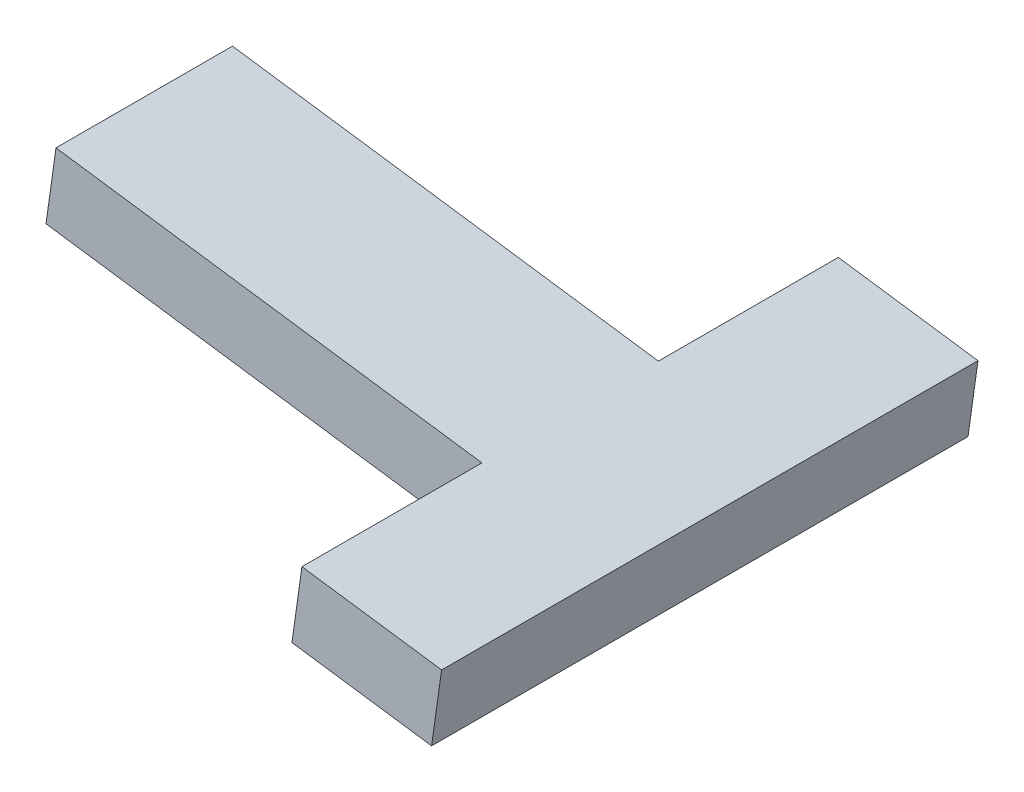
ISO-10303-21;
HEADER;
FILE_DESCRIPTION(('STEP AP214'),'2;1');
FILE_NAME('part.step','',(''),(''),'','','');
FILE_SCHEMA(('AUTOMOTIVE_DESIGN { 1 0 10303 214 1 1 1 1 }'));
ENDSEC;
DATA;
#1=APPLICATION_CONTEXT('core data for automotive mechanical design processes');
#2=APPLICATION_PROTOCOL_DEFINITION('international standard','automotive_design',2000,#1);
#3=PRODUCT_CONTEXT('',#1,'mechanical');
#4=PRODUCT('Part','Part','',(#3));
#5=PRODUCT_RELATED_PRODUCT_CATEGORY('part','',(#4));
#6=PRODUCT_DEFINITION_FORMATION('','',#4);
#7=PRODUCT_DEFINITION_CONTEXT('part definition',#1,'design');
#8=PRODUCT_DEFINITION('design','',#6,#7);
#9=PRODUCT_DEFINITION_SHAPE('','',#8);
#10=(LENGTH_UNIT() NAMED_UNIT(*) SI_UNIT(.MILLI.,.METRE.));
#11=(NAMED_UNIT(*) PLANE_ANGLE_UNIT() SI_UNIT($,.RADIAN.));
#12=(NAMED_UNIT(*) SI_UNIT($,.STERADIAN.) SOLID_ANGLE_UNIT());
#13=UNCERTAINTY_MEASURE_WITH_UNIT(LENGTH_MEASURE(1.E-05),#10,'distance_accuracy_value','');
#14=(GEOMETRIC_REPRESENTATION_CONTEXT(3) GLOBAL_UNCERTAINTY_ASSIGNED_CONTEXT((#13)) GLOBAL_UNIT_ASSIGNED_CONTEXT((#10,
#11,#12)) REPRESENTATION_CONTEXT('',''));
#15=CARTESIAN_POINT('',(0.,0.,0.));
#16=DIRECTION('',(0.,0.,1.));
#17=DIRECTION('',(1.,0.,0.));
#18=AXIS2_PLACEMENT_3D('',#15,#16,#17);
#19=CARTESIAN_POINT('',(883.811506568941,612.293995374237,2698.43487768757));
#20=DIRECTION('',(0.990268068741567,-0.139173100960088,0.));
#21=DIRECTION('',(-0.000106014336863081,-0.000754331202662863,-0.999999709872657));
#22=AXIS2_PLACEMENT_3D('',#19,#20,#21);
#23=PLANE('',#22);
#24=CARTESIAN_POINT('',(882.419775963119,602.39131755986,2698.44249513205));
#25=CARTESIAN_POINT('',(882.423759093866,602.419659007774,2736.0141076967));
#26=CARTESIAN_POINT('',(882.427742224612,602.448000455689,2773.58572026135));
#27=B_SPLINE_CURVE_WITH_KNOTS('',2,(#24,#25,#26),.UNSPECIFIED.,.F.,.F.,(3,3),(0.,1.),.UNSPECIFIED.);
#28=CARTESIAN_POINT('',(882.419775963119,602.39131755986,2698.44249513205));
#29=VERTEX_POINT('',#28);
#30=CARTESIAN_POINT('',(882.427742224612,602.448000455689,2773.58572026135));
#31=VERTEX_POINT('',#30);
#32=EDGE_CURVE('E122',#29,#31,#27,.T.);
#33=ORIENTED_EDGE('',*,*,#32,.F.);
#34=DIRECTION('',(-0.139173060582166,-0.990267781437723,0.000761744447259926));
#35=VECTOR('',#34,1.);
#36=CARTESIAN_POINT('',(883.811506568941,612.293995374237,2698.43487768757));
#37=LINE('',#36,#35);
#38=CARTESIAN_POINT('',(883.811506568941,612.293995374237,2698.43487768757));
#39=VERTEX_POINT('',#38);
#40=EDGE_CURVE('E33',#39,#29,#37,.T.);
#41=ORIENTED_EDGE('',*,*,#40,.F.);
#42=CARTESIAN_POINT('',(883.811506568941,612.293995374237,2698.43487768757));
#43=CARTESIAN_POINT('',(883.815489699688,612.322336822151,2736.00649025222));
#44=CARTESIAN_POINT('',(883.819472830434,612.350678270066,2773.57810281688));
#45=B_SPLINE_CURVE_WITH_KNOTS('',2,(#42,#43,#44),.UNSPECIFIED.,.F.,.F.,(3,3),(0.,1.),.UNSPECIFIED.);
#46=CARTESIAN_POINT('',(883.819472830434,612.350678270066,2773.57810281688));
#47=VERTEX_POINT('',#46);
#48=EDGE_CURVE('E182',#39,#47,#45,.T.);
#49=ORIENTED_EDGE('',*,*,#48,.T.);
#50=DIRECTION('',(-0.139173060582166,-0.990267781437723,0.000761744447259926));
#51=VECTOR('',#50,1.);
#52=CARTESIAN_POINT('',(883.819472830434,612.350678270066,2773.57810281688));
#53=LINE('',#52,#51);
#54=EDGE_CURVE('E11',#47,#31,#53,.T.);
#55=ORIENTED_EDGE('',*,*,#54,.T.);
#56=EDGE_LOOP('',(#33,#41,#49,#55));
#57=FACE_BOUND('',#56,.T.);
#58=ADVANCED_FACE('F17',(#57),#23,.T.);
#59=CARTESIAN_POINT('',(883.819472830434,612.350678270066,2773.57810281688));
#60=DIRECTION('',(0.000106014336862192,0.000754331202662988,0.999999709872657));
#61=DIRECTION('',(0.990268068741567,-0.139173100960088,0.));
#62=AXIS2_PLACEMENT_3D('',#59,#60,#61);
#63=PLANE('',#62);
#64=CARTESIAN_POINT('',(882.427742224612,602.448000455689,2773.58572026135));
#65=CARTESIAN_POINT('',(872.646649703891,603.822643362852,2773.58572026135));
#66=CARTESIAN_POINT('',(862.865557183169,605.197286270016,2773.58572026135));
#67=B_SPLINE_CURVE_WITH_KNOTS('',2,(#64,#65,#66),.UNSPECIFIED.,.F.,.F.,(3,3),(1.,2.),.UNSPECIFIED.);
#68=CARTESIAN_POINT('',(862.865557183169,605.197286270016,2773.58572026135));
#69=VERTEX_POINT('',#68);
#70=EDGE_CURVE('E130',#31,#69,#67,.T.);
#71=ORIENTED_EDGE('',*,*,#70,.F.);
#72=ORIENTED_EDGE('',*,*,#54,.F.);
#73=CARTESIAN_POINT('',(883.819472830434,612.350678270066,2773.57810281688));
#74=CARTESIAN_POINT('',(874.038380309712,613.72532117723,2773.57810281688));
#75=CARTESIAN_POINT('',(864.257287788991,615.099964084393,2773.57810281688));
#76=B_SPLINE_CURVE_WITH_KNOTS('',2,(#73,#74,#75),.UNSPECIFIED.,.F.,.F.,(3,3),(1.,2.),.UNSPECIFIED.);
#77=CARTESIAN_POINT('',(864.257287788991,615.099964084393,2773.57810281688));
#78=VERTEX_POINT('',#77);
#79=EDGE_CURVE('E194',#47,#78,#76,.T.);
#80=ORIENTED_EDGE('',*,*,#79,.T.);
#81=DIRECTION('',(-0.139173060582166,-0.990267781437723,0.000761744447259926));
#82=VECTOR('',#81,1.);
#83=CARTESIAN_POINT('',(864.257287788991,615.099964084393,2773.57810281688));
#84=LINE('',#83,#82);
#85=EDGE_CURVE('E25',#78,#69,#84,.T.);
#86=ORIENTED_EDGE('',*,*,#85,.T.);
#87=EDGE_LOOP('',(#71,#72,#80,#86));
#88=FACE_BOUND('',#87,.T.);
#89=ADVANCED_FACE('F193',(#88),#63,.T.);
#90=CARTESIAN_POINT('',(864.257287788991,615.099964084393,2773.57810281688));
#91=DIRECTION('',(-0.990268068741567,0.139173100960088,0.));
#92=DIRECTION('',(0.000106014336857196,0.000754331202663702,0.999999709872657));
#93=AXIS2_PLACEMENT_3D('',#90,#91,#92);
#94=PLANE('',#93);
#95=CARTESIAN_POINT('',(862.865557183169,605.197286270016,2773.58572026135));
#96=CARTESIAN_POINT('',(862.864220795076,605.187777374637,2760.97999404141));
#97=CARTESIAN_POINT('',(862.862884406982,605.178268479259,2748.37426782145));
#98=B_SPLINE_CURVE_WITH_KNOTS('',2,(#95,#96,#97),.UNSPECIFIED.,.F.,.F.,(3,3),(2.,3.),.UNSPECIFIED.);
#99=CARTESIAN_POINT('',(862.862884406982,605.178268479259,2748.37426782145));
#100=VERTEX_POINT('',#99);
#101=EDGE_CURVE('E138',#69,#100,#98,.T.);
#102=ORIENTED_EDGE('',*,*,#101,.F.);
#103=ORIENTED_EDGE('',*,*,#85,.F.);
#104=CARTESIAN_POINT('',(864.257287788991,615.099964084393,2773.57810281688));
#105=CARTESIAN_POINT('',(864.255951400897,615.090455189015,2760.97237659694));
#106=CARTESIAN_POINT('',(864.254615012804,615.080946293636,2748.36665037699));
#107=B_SPLINE_CURVE_WITH_KNOTS('',2,(#104,#105,#106),.UNSPECIFIED.,.F.,.F.,(3,3),(2.,3.),.UNSPECIFIED.);
#108=CARTESIAN_POINT('',(864.254615012804,615.080946293636,2748.36665037699));
#109=VERTEX_POINT('',#108);
#110=EDGE_CURVE('E203',#78,#109,#107,.T.);
#111=ORIENTED_EDGE('',*,*,#110,.T.);
#112=DIRECTION('',(-0.139173060582166,-0.990267781437723,0.000761744447259926));
#113=VECTOR('',#112,1.);
#114=CARTESIAN_POINT('',(864.254615012804,615.080946293636,2748.36665037699));
#115=LINE('',#114,#113);
#116=EDGE_CURVE('E191',#109,#100,#115,.T.);
#117=ORIENTED_EDGE('',*,*,#116,.T.);
#118=EDGE_LOOP('',(#102,#103,#111,#117));
#119=FACE_BOUND('',#118,.T.);
#120=ADVANCED_FACE('F198',(#119),#94,.T.);
#121=CARTESIAN_POINT('',(864.254615012804,615.080946293636,2748.36665037699));
#122=DIRECTION('',(0.000106014336870075,0.000754331202661877,0.999999709872657));
#123=DIRECTION('',(0.990268068741567,-0.139173100960088,0.));
#124=AXIS2_PLACEMENT_3D('',#121,#122,#123);
#125=PLANE('',#124);
#126=CARTESIAN_POINT('',(862.862884406982,605.178268479259,2748.37426782145));
#127=CARTESIAN_POINT('',(833.033254178041,609.370549610498,2748.37426782145));
#128=CARTESIAN_POINT('',(803.2036239491,613.562830741738,2748.37426782145));
#129=B_SPLINE_CURVE_WITH_KNOTS('',2,(#126,#127,#128),.UNSPECIFIED.,.F.,.F.,(3,3),(3.,4.),.UNSPECIFIED.);
#130=CARTESIAN_POINT('',(803.2036239491,613.562830741738,2748.37426782145));
#131=VERTEX_POINT('',#130);
#132=EDGE_CURVE('E146',#100,#131,#129,.T.);
#133=ORIENTED_EDGE('',*,*,#132,.F.);
#134=ORIENTED_EDGE('',*,*,#116,.F.);
#135=CARTESIAN_POINT('',(864.254615012804,615.080946293636,2748.36665037699));
#136=CARTESIAN_POINT('',(834.424984783862,619.273227424876,2748.36665037699));
#137=CARTESIAN_POINT('',(804.595354554921,623.465508556115,2748.36665037699));
#138=B_SPLINE_CURVE_WITH_KNOTS('',2,(#135,#136,#137),.UNSPECIFIED.,.F.,.F.,(3,3),(3.,4.),.UNSPECIFIED.);
#139=CARTESIAN_POINT('',(804.595354554921,623.465508556115,2748.36665037699));
#140=VERTEX_POINT('',#139);
#141=EDGE_CURVE('E219',#109,#140,#138,.T.);
#142=ORIENTED_EDGE('',*,*,#141,.T.);
#143=DIRECTION('',(-0.139173060582166,-0.990267781437723,0.000761744447259926));
#144=VECTOR('',#143,1.);
#145=CARTESIAN_POINT('',(804.595354554921,623.465508556115,2748.36665037699));
#146=LINE('',#145,#144);
#147=EDGE_CURVE('E189',#140,#131,#146,.T.);
#148=ORIENTED_EDGE('',*,*,#147,.T.);
#149=EDGE_LOOP('',(#133,#134,#142,#148));
#150=FACE_BOUND('',#149,.T.);
#151=ADVANCED_FACE('F239',(#150),#125,.T.);
#152=CARTESIAN_POINT('',(804.595354554921,623.465508556115,2748.36665037699));
#153=DIRECTION('',(-0.990268068741567,0.139173100960088,0.));
#154=DIRECTION('',(0.000106014336864912,0.000754331202662613,0.999999709872657));
#155=AXIS2_PLACEMENT_3D('',#152,#153,#154);
#156=PLANE('',#155);
#157=CARTESIAN_POINT('',(803.2036239491,613.562830741738,2748.37426782145));
#158=CARTESIAN_POINT('',(803.20231359454,613.553507084581,2736.0141076967));
#159=CARTESIAN_POINT('',(803.201003239981,613.544183427424,2723.65394757195));
#160=B_SPLINE_CURVE_WITH_KNOTS('',2,(#157,#158,#159),.UNSPECIFIED.,.F.,.F.,(3,3),(4.,5.),.UNSPECIFIED.);
#161=CARTESIAN_POINT('',(803.201003239981,613.544183427424,2723.65394757195));
#162=VERTEX_POINT('',#161);
#163=EDGE_CURVE('E154',#131,#162,#160,.T.);
#164=ORIENTED_EDGE('',*,*,#163,.F.);
#165=ORIENTED_EDGE('',*,*,#147,.F.);
#166=CARTESIAN_POINT('',(804.595354554921,623.465508556115,2748.36665037699));
#167=CARTESIAN_POINT('',(804.594044200362,623.456184898958,2736.00649025223));
#168=CARTESIAN_POINT('',(804.592733845803,623.446861241801,2723.64633012747));
#169=B_SPLINE_CURVE_WITH_KNOTS('',2,(#166,#167,#168),.UNSPECIFIED.,.F.,.F.,(3,3),(4.,5.),.UNSPECIFIED.);
#170=CARTESIAN_POINT('',(804.592733845803,623.446861241801,2723.64633012747));
#171=VERTEX_POINT('',#170);
#172=EDGE_CURVE('E104',#140,#171,#169,.T.);
#173=ORIENTED_EDGE('',*,*,#172,.T.);
#174=DIRECTION('',(-0.139173060582166,-0.990267781437723,0.000761744447259926));
#175=VECTOR('',#174,1.);
#176=CARTESIAN_POINT('',(804.592733845803,623.446861241801,2723.64633012747));
#177=LINE('',#176,#175);
#178=EDGE_CURVE('E96',#171,#162,#177,.T.);
#179=ORIENTED_EDGE('',*,*,#178,.T.);
#180=EDGE_LOOP('',(#164,#165,#173,#179));
#181=FACE_BOUND('',#180,.T.);
#182=ADVANCED_FACE('F236',(#181),#156,.T.);
#183=CARTESIAN_POINT('',(804.592733845803,623.446861241801,2723.64633012747));
#184=DIRECTION('',(-0.000106014336863081,-0.000754331202662863,-0.999999709872657));
#185=DIRECTION('',(-0.990268068741567,0.139173100960088,0.));
#186=AXIS2_PLACEMENT_3D('',#183,#184,#185);
#187=PLANE('',#186);
#188=CARTESIAN_POINT('',(803.201003239981,613.544183427424,2723.65394757195));
#189=CARTESIAN_POINT('',(833.030633468922,609.351902296184,2723.65394757195));
#190=CARTESIAN_POINT('',(862.860263697863,605.159621164945,2723.65394757195));
#191=B_SPLINE_CURVE_WITH_KNOTS('',2,(#188,#189,#190),.UNSPECIFIED.,.F.,.F.,(3,3),(5.,6.),.UNSPECIFIED.);
#192=CARTESIAN_POINT('',(862.860263697863,605.159621164945,2723.65394757195));
#193=VERTEX_POINT('',#192);
#194=EDGE_CURVE('E162',#162,#193,#191,.T.);
#195=ORIENTED_EDGE('',*,*,#194,.F.);
#196=ORIENTED_EDGE('',*,*,#178,.F.);
#197=CARTESIAN_POINT('',(804.592733845803,623.446861241801,2723.64633012747));
#198=CARTESIAN_POINT('',(834.422364074744,619.254580110562,2723.64633012747));
#199=CARTESIAN_POINT('',(864.251994303685,615.062298979322,2723.64633012747));
#200=B_SPLINE_CURVE_WITH_KNOTS('',2,(#197,#198,#199),.UNSPECIFIED.,.F.,.F.,(3,3),(5.,6.),.UNSPECIFIED.);
#201=CARTESIAN_POINT('',(864.251994303685,615.062298979322,2723.64633012747));
#202=VERTEX_POINT('',#201);
#203=EDGE_CURVE('E99',#171,#202,#200,.T.);
#204=ORIENTED_EDGE('',*,*,#203,.T.);
#205=DIRECTION('',(-0.139173060582166,-0.990267781437723,0.000761744447259926));
#206=VECTOR('',#205,1.);
#207=CARTESIAN_POINT('',(864.251994303685,615.062298979322,2723.64633012747));
#208=LINE('',#207,#206);
#209=EDGE_CURVE('E85',#202,#193,#208,.T.);
#210=ORIENTED_EDGE('',*,*,#209,.T.);
#211=EDGE_LOOP('',(#195,#196,#204,#210));
#212=FACE_BOUND('',#211,.T.);
#213=ADVANCED_FACE('F100',(#212),#187,.T.);
#214=CARTESIAN_POINT('',(864.251994303685,615.062298979322,2723.64633012747));
#215=DIRECTION('',(-0.990268068741567,0.139173100960088,0.));
#216=DIRECTION('',(0.000106014336862137,0.000754331202663001,0.999999709872657));
#217=AXIS2_PLACEMENT_3D('',#214,#215,#216);
#218=PLANE('',#217);
#219=CARTESIAN_POINT('',(862.860263697863,605.159621164945,2723.65394757195));
#220=CARTESIAN_POINT('',(862.85892730977,605.150112269566,2711.04822135199));
#221=CARTESIAN_POINT('',(862.857590921676,605.140603374187,2698.44249513205));
#222=B_SPLINE_CURVE_WITH_KNOTS('',2,(#219,#220,#221),.UNSPECIFIED.,.F.,.F.,(3,3),(6.,7.),.UNSPECIFIED.);
#223=CARTESIAN_POINT('',(862.857590921676,605.140603374187,2698.44249513205));
#224=VERTEX_POINT('',#223);
#225=EDGE_CURVE('E92',#193,#224,#222,.T.);
#226=ORIENTED_EDGE('',*,*,#225,.F.);
#227=ORIENTED_EDGE('',*,*,#209,.F.);
#228=CARTESIAN_POINT('',(864.251994303685,615.062298979322,2723.64633012747));
#229=CARTESIAN_POINT('',(864.250657915591,615.052790083943,2711.04060390752));
#230=CARTESIAN_POINT('',(864.249321527498,615.043281188564,2698.43487768757));
#231=B_SPLINE_CURVE_WITH_KNOTS('',2,(#228,#229,#230),.UNSPECIFIED.,.F.,.F.,(3,3),(6.,7.),.UNSPECIFIED.);
#232=CARTESIAN_POINT('',(864.249321527498,615.043281188564,2698.43487768757));
#233=VERTEX_POINT('',#232);
#234=EDGE_CURVE('E89',#202,#233,#231,.T.);
#235=ORIENTED_EDGE('',*,*,#234,.T.);
#236=DIRECTION('',(-0.139173060582166,-0.990267781437723,0.000761744447259926));
#237=VECTOR('',#236,1.);
#238=CARTESIAN_POINT('',(864.249321527498,615.043281188564,2698.43487768757));
#239=LINE('',#238,#237);
#240=EDGE_CURVE('E61',#233,#224,#239,.T.);
#241=ORIENTED_EDGE('',*,*,#240,.T.);
#242=EDGE_LOOP('',(#226,#227,#235,#241));
#243=FACE_BOUND('',#242,.T.);
#244=ADVANCED_FACE('F87',(#243),#218,.T.);
#245=CARTESIAN_POINT('',(864.249321527498,615.043281188564,2698.43487768757));
#246=DIRECTION('',(-0.000106014336862192,-0.000754331202662988,-0.999999709872657));
#247=DIRECTION('',(-0.990268068741567,0.139173100960088,0.));
#248=AXIS2_PLACEMENT_3D('',#245,#246,#247);
#249=PLANE('',#248);
#250=CARTESIAN_POINT('',(862.857590921676,605.140603374187,2698.44249513205));
#251=CARTESIAN_POINT('',(872.638683442398,603.765960467023,2698.44249513205));
#252=CARTESIAN_POINT('',(882.419775963119,602.39131755986,2698.44249513205));
#253=B_SPLINE_CURVE_WITH_KNOTS('',2,(#250,#251,#252),.UNSPECIFIED.,.F.,.F.,(3,3),(7.,8.),.UNSPECIFIED.);
#254=EDGE_CURVE('E175',#224,#29,#253,.T.);
#255=ORIENTED_EDGE('',*,*,#254,.F.);
#256=ORIENTED_EDGE('',*,*,#240,.F.);
#257=CARTESIAN_POINT('',(864.249321527498,615.043281188564,2698.43487768757));
#258=CARTESIAN_POINT('',(874.030414048219,613.668638281401,2698.43487768757));
#259=CARTESIAN_POINT('',(883.811506568941,612.293995374237,2698.43487768757));
#260=B_SPLINE_CURVE_WITH_KNOTS('',2,(#257,#258,#259),.UNSPECIFIED.,.F.,.F.,(3,3),(7.,8.),.UNSPECIFIED.);
#261=EDGE_CURVE('E108',#233,#39,#260,.T.);
#262=ORIENTED_EDGE('',*,*,#261,.T.);
#263=ORIENTED_EDGE('',*,*,#40,.T.);
#264=EDGE_LOOP('',(#255,#256,#262,#263));
#265=FACE_BOUND('',#264,.T.);
#266=ADVANCED_FACE('F294',(#265),#249,.T.);
#267=CARTESIAN_POINT('',(883.815489699688,612.322336822151,2736.00649025223));
#268=DIRECTION('',(0.139173060582154,0.990267781437725,-0.00076174444726288));
#269=DIRECTION('',(-0.947941965636706,0.133001987377277,-0.289338039563609));
#270=AXIS2_PLACEMENT_3D('',#267,#268,#269);
#271=PLANE('',#270);
#272=ORIENTED_EDGE('',*,*,#48,.F.);
#273=ORIENTED_EDGE('',*,*,#261,.F.);
#274=ORIENTED_EDGE('',*,*,#234,.F.);
#275=ORIENTED_EDGE('',*,*,#203,.F.);
#276=ORIENTED_EDGE('',*,*,#172,.F.);
#277=ORIENTED_EDGE('',*,*,#141,.F.);
#278=ORIENTED_EDGE('',*,*,#110,.F.);
#279=ORIENTED_EDGE('',*,*,#79,.F.);
#280=EDGE_LOOP('',(#272,#273,#274,#275,#276,#277,#278,#279));
#281=FACE_BOUND('',#280,.T.);
#282=ADVANCED_FACE('F107',(#281),#271,.T.);
#283=CARTESIAN_POINT('',(882.423759093866,602.419659007774,2736.0141076967));
#284=DIRECTION('',(0.139173060582154,0.990267781437725,-0.00076174444726288));
#285=DIRECTION('',(-0.947941965636706,0.133001987377277,-0.289338039563609));
#286=AXIS2_PLACEMENT_3D('',#283,#284,#285);
#287=PLANE('',#286);
#288=ORIENTED_EDGE('',*,*,#32,.T.);
#289=ORIENTED_EDGE('',*,*,#70,.T.);
#290=ORIENTED_EDGE('',*,*,#101,.T.);
#291=ORIENTED_EDGE('',*,*,#132,.T.);
#292=ORIENTED_EDGE('',*,*,#163,.T.);
#293=ORIENTED_EDGE('',*,*,#194,.T.);
#294=ORIENTED_EDGE('',*,*,#225,.T.);
#295=ORIENTED_EDGE('',*,*,#254,.T.);
#296=EDGE_LOOP('',(#288,#289,#290,#291,#292,#293,#294,#295));
#297=FACE_BOUND('',#296,.T.);
#298=ADVANCED_FACE('F201',(#297),#287,.F.);
#299=CLOSED_SHELL('',(#58,#89,#120,#151,#182,#213,#244,#266,#282,#298));
#300=MANIFOLD_SOLID_BREP('B1',#299);
#301=ADVANCED_BREP_SHAPE_REPRESENTATION('',(#18,#300),#14);
#302=SHAPE_DEFINITION_REPRESENTATION(#9,#301);
ENDSEC;
END-ISO-10303-21;
